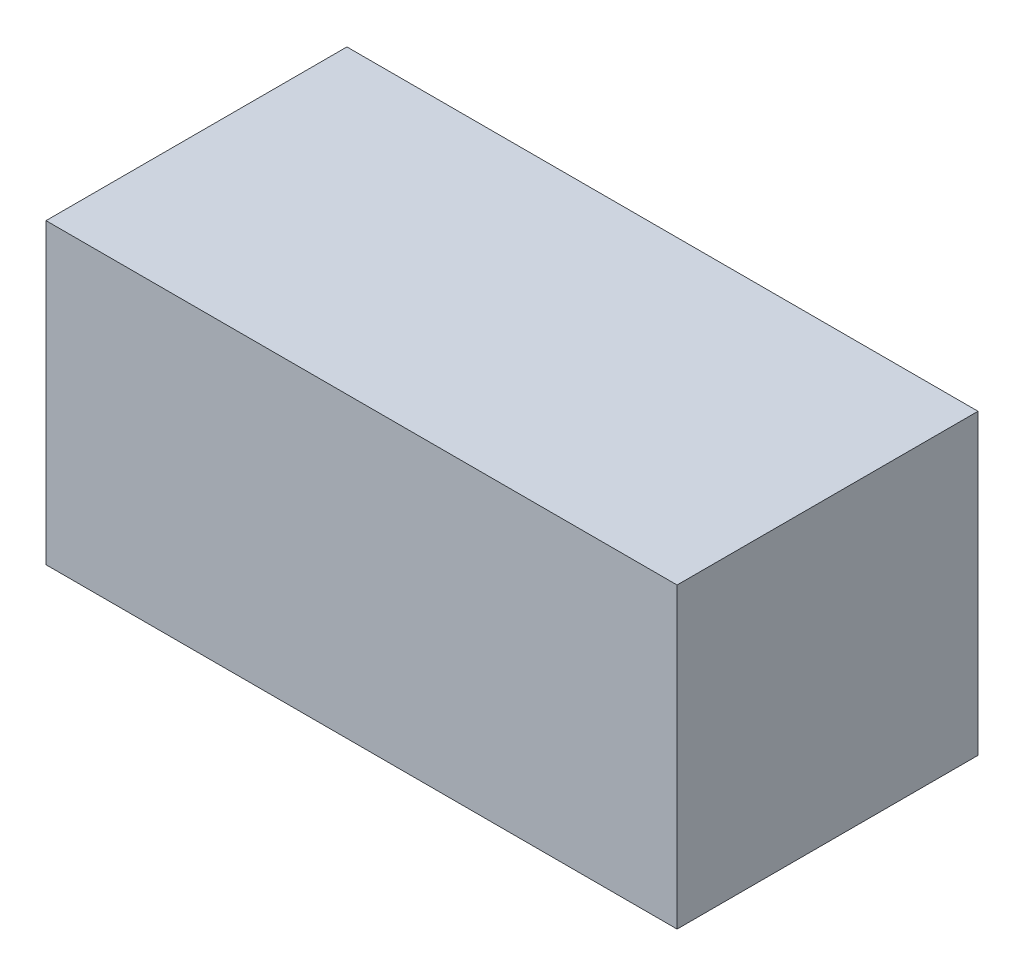
ISO-10303-21;
HEADER;
FILE_DESCRIPTION(('STEP AP214'),'2;1');
FILE_NAME('part.step','',(''),(''),'','','');
FILE_SCHEMA(('AUTOMOTIVE_DESIGN { 1 0 10303 214 1 1 1 1 }'));
ENDSEC;
DATA;
#1=APPLICATION_CONTEXT('core data for automotive mechanical design processes');
#2=APPLICATION_PROTOCOL_DEFINITION('international standard','automotive_design',2000,#1);
#3=PRODUCT_CONTEXT('',#1,'mechanical');
#4=PRODUCT('Part','Part','',(#3));
#5=PRODUCT_RELATED_PRODUCT_CATEGORY('part','',(#4));
#6=PRODUCT_DEFINITION_FORMATION('','',#4);
#7=PRODUCT_DEFINITION_CONTEXT('part definition',#1,'design');
#8=PRODUCT_DEFINITION('design','',#6,#7);
#9=PRODUCT_DEFINITION_SHAPE('','',#8);
#10=(LENGTH_UNIT() NAMED_UNIT(*) SI_UNIT(.MILLI.,.METRE.));
#11=(NAMED_UNIT(*) PLANE_ANGLE_UNIT() SI_UNIT($,.RADIAN.));
#12=(NAMED_UNIT(*) SI_UNIT($,.STERADIAN.) SOLID_ANGLE_UNIT());
#13=UNCERTAINTY_MEASURE_WITH_UNIT(LENGTH_MEASURE(1.E-05),#10,'distance_accuracy_value','');
#14=(GEOMETRIC_REPRESENTATION_CONTEXT(3) GLOBAL_UNCERTAINTY_ASSIGNED_CONTEXT((#13)) GLOBAL_UNIT_ASSIGNED_CONTEXT((#10,
#11,#12)) REPRESENTATION_CONTEXT('',''));
#15=CARTESIAN_POINT('',(0.,0.,0.));
#16=DIRECTION('',(0.,0.,1.));
#17=DIRECTION('',(1.,0.,0.));
#18=AXIS2_PLACEMENT_3D('',#15,#16,#17);
#19=CARTESIAN_POINT('',(-2.286,-1.0795,0.));
#20=DIRECTION('',(0.,1.,0.));
#21=DIRECTION('',(0.,0.,1.));
#22=AXIS2_PLACEMENT_3D('',#19,#20,#21);
#23=PLANE('',#22);
#24=DIRECTION('',(0.,0.,1.));
#25=VECTOR('',#24,1.);
#26=CARTESIAN_POINT('',(2.286,-1.0795,0.));
#27=LINE('',#26,#25);
#28=CARTESIAN_POINT('',(2.286,-1.0795,0.));
#29=VERTEX_POINT('',#28);
#30=CARTESIAN_POINT('',(2.286,-1.0795,2.18000072));
#31=VERTEX_POINT('',#30);
#32=EDGE_CURVE('E20',#29,#31,#27,.T.);
#33=ORIENTED_EDGE('',*,*,#32,.T.);
#34=DIRECTION('',(-1.,0.,0.));
#35=VECTOR('',#34,1.);
#36=CARTESIAN_POINT('',(2.286,-1.0795,2.18000072));
#37=LINE('',#36,#35);
#38=CARTESIAN_POINT('',(-2.286,-1.0795,2.18000072));
#39=VERTEX_POINT('',#38);
#40=EDGE_CURVE('E55',#31,#39,#37,.T.);
#41=ORIENTED_EDGE('',*,*,#40,.T.);
#42=DIRECTION('',(0.,0.,-1.));
#43=VECTOR('',#42,1.);
#44=CARTESIAN_POINT('',(-2.286,-1.0795,0.));
#45=LINE('',#44,#43);
#46=CARTESIAN_POINT('',(-2.286,-1.0795,0.));
#47=VERTEX_POINT('',#46);
#48=EDGE_CURVE('E76',#39,#47,#45,.T.);
#49=ORIENTED_EDGE('',*,*,#48,.T.);
#50=DIRECTION('',(-1.,0.,0.));
#51=VECTOR('',#50,1.);
#52=CARTESIAN_POINT('',(2.286,-1.0795,0.));
#53=LINE('',#52,#51);
#54=EDGE_CURVE('E58',#29,#47,#53,.T.);
#55=ORIENTED_EDGE('',*,*,#54,.F.);
#56=EDGE_LOOP('',(#33,#41,#49,#55));
#57=FACE_BOUND('',#56,.T.);
#58=ADVANCED_FACE('F17',(#57),#23,.F.);
#59=CARTESIAN_POINT('',(2.286,-1.0795,0.));
#60=DIRECTION('',(-1.,0.,0.));
#61=DIRECTION('',(0.,0.,1.));
#62=AXIS2_PLACEMENT_3D('',#59,#60,#61);
#63=PLANE('',#62);
#64=DIRECTION('',(0.,0.,-1.));
#65=VECTOR('',#64,1.);
#66=CARTESIAN_POINT('',(2.286,1.0795,0.));
#67=LINE('',#66,#65);
#68=CARTESIAN_POINT('',(2.286,1.0795,0.));
#69=VERTEX_POINT('',#68);
#70=CARTESIAN_POINT('',(2.286,1.0795,2.18000072));
#71=VERTEX_POINT('',#70);
#72=EDGE_CURVE('E73',#69,#71,#67,.F.);
#73=ORIENTED_EDGE('',*,*,#72,.T.);
#74=DIRECTION('',(0.,1.,0.));
#75=VECTOR('',#74,1.);
#76=CARTESIAN_POINT('',(2.286,1.0795,2.18000072));
#77=LINE('',#76,#75);
#78=EDGE_CURVE('E63',#71,#31,#77,.F.);
#79=ORIENTED_EDGE('',*,*,#78,.T.);
#80=ORIENTED_EDGE('',*,*,#32,.F.);
#81=DIRECTION('',(0.,1.,0.));
#82=VECTOR('',#81,1.);
#83=CARTESIAN_POINT('',(2.286,1.0795,0.));
#84=LINE('',#83,#82);
#85=EDGE_CURVE('E78',#69,#29,#84,.F.);
#86=ORIENTED_EDGE('',*,*,#85,.F.);
#87=EDGE_LOOP('',(#73,#79,#80,#86));
#88=FACE_BOUND('',#87,.T.);
#89=ADVANCED_FACE('F72',(#88),#63,.F.);
#90=CARTESIAN_POINT('',(2.286,1.0795,2.18000072));
#91=DIRECTION('',(0.,0.,-1.));
#92=DIRECTION('',(-1.,0.,0.));
#93=AXIS2_PLACEMENT_3D('',#90,#91,#92);
#94=PLANE('',#93);
#95=DIRECTION('',(0.,1.,0.));
#96=VECTOR('',#95,1.);
#97=CARTESIAN_POINT('',(-2.286,1.0795,2.18000072));
#98=LINE('',#97,#96);
#99=CARTESIAN_POINT('',(-2.286,1.0795,2.18000072));
#100=VERTEX_POINT('',#99);
#101=EDGE_CURVE('E69',#100,#39,#98,.F.);
#102=ORIENTED_EDGE('',*,*,#101,.T.);
#103=ORIENTED_EDGE('',*,*,#40,.F.);
#104=ORIENTED_EDGE('',*,*,#78,.F.);
#105=DIRECTION('',(1.,0.,0.));
#106=VECTOR('',#105,1.);
#107=CARTESIAN_POINT('',(2.286,1.0795,2.18000072));
#108=LINE('',#107,#106);
#109=EDGE_CURVE('E83',#71,#100,#108,.F.);
#110=ORIENTED_EDGE('',*,*,#109,.T.);
#111=EDGE_LOOP('',(#102,#103,#104,#110));
#112=FACE_BOUND('',#111,.T.);
#113=ADVANCED_FACE('F66',(#112),#94,.F.);
#114=CARTESIAN_POINT('',(-2.286,1.0795,0.));
#115=DIRECTION('',(1.,0.,0.));
#116=DIRECTION('',(0.,0.,-1.));
#117=AXIS2_PLACEMENT_3D('',#114,#115,#116);
#118=PLANE('',#117);
#119=ORIENTED_EDGE('',*,*,#48,.F.);
#120=ORIENTED_EDGE('',*,*,#101,.F.);
#121=DIRECTION('',(0.,0.,-1.));
#122=VECTOR('',#121,1.);
#123=CARTESIAN_POINT('',(-2.286,1.0795,0.));
#124=LINE('',#123,#122);
#125=CARTESIAN_POINT('',(-2.286,1.0795,0.));
#126=VERTEX_POINT('',#125);
#127=EDGE_CURVE('E26',#100,#126,#124,.T.);
#128=ORIENTED_EDGE('',*,*,#127,.T.);
#129=DIRECTION('',(0.,1.,0.));
#130=VECTOR('',#129,1.);
#131=CARTESIAN_POINT('',(-2.286,1.0795,0.));
#132=LINE('',#131,#130);
#133=EDGE_CURVE('E34',#47,#126,#132,.T.);
#134=ORIENTED_EDGE('',*,*,#133,.F.);
#135=EDGE_LOOP('',(#119,#120,#128,#134));
#136=FACE_BOUND('',#135,.T.);
#137=ADVANCED_FACE('F88',(#136),#118,.F.);
#138=CARTESIAN_POINT('',(2.286,1.0795,0.));
#139=DIRECTION('',(0.,0.,-1.));
#140=DIRECTION('',(-1.,0.,0.));
#141=AXIS2_PLACEMENT_3D('',#138,#139,#140);
#142=PLANE('',#141);
#143=ORIENTED_EDGE('',*,*,#133,.T.);
#144=DIRECTION('',(1.,0.,0.));
#145=VECTOR('',#144,1.);
#146=CARTESIAN_POINT('',(2.286,1.0795,0.));
#147=LINE('',#146,#145);
#148=EDGE_CURVE('E11',#126,#69,#147,.T.);
#149=ORIENTED_EDGE('',*,*,#148,.T.);
#150=ORIENTED_EDGE('',*,*,#85,.T.);
#151=ORIENTED_EDGE('',*,*,#54,.T.);
#152=EDGE_LOOP('',(#143,#149,#150,#151));
#153=FACE_BOUND('',#152,.T.);
#154=ADVANCED_FACE('F91',(#153),#142,.T.);
#155=CARTESIAN_POINT('',(2.286,1.0795,0.));
#156=DIRECTION('',(0.,-1.,0.));
#157=DIRECTION('',(0.,0.,-1.));
#158=AXIS2_PLACEMENT_3D('',#155,#156,#157);
#159=PLANE('',#158);
#160=ORIENTED_EDGE('',*,*,#127,.F.);
#161=ORIENTED_EDGE('',*,*,#109,.F.);
#162=ORIENTED_EDGE('',*,*,#72,.F.);
#163=ORIENTED_EDGE('',*,*,#148,.F.);
#164=EDGE_LOOP('',(#160,#161,#162,#163));
#165=FACE_BOUND('',#164,.T.);
#166=ADVANCED_FACE('F90',(#165),#159,.F.);
#167=CLOSED_SHELL('',(#58,#89,#113,#137,#154,#166));
#168=MANIFOLD_SOLID_BREP('B1',#167);
#169=ADVANCED_BREP_SHAPE_REPRESENTATION('',(#18,#168),#14);
#170=SHAPE_DEFINITION_REPRESENTATION(#9,#169);
ENDSEC;
END-ISO-10303-21;
